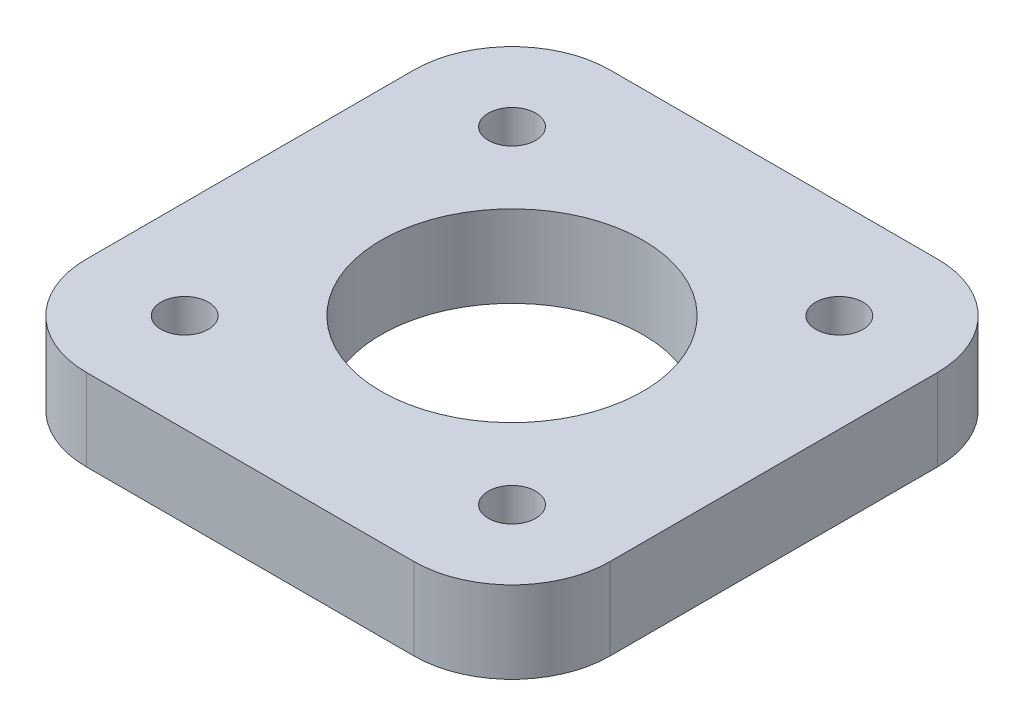
ISO-10303-21;
HEADER;
FILE_DESCRIPTION(('STEP AP214'),'2;1');
FILE_NAME('part.step','',(''),(''),'','','');
FILE_SCHEMA(('AUTOMOTIVE_DESIGN { 1 0 10303 214 1 1 1 1 }'));
ENDSEC;
DATA;
#1=APPLICATION_CONTEXT('core data for automotive mechanical design processes');
#2=APPLICATION_PROTOCOL_DEFINITION('international standard','automotive_design',2000,#1);
#3=PRODUCT_CONTEXT('',#1,'mechanical');
#4=PRODUCT('Part','Part','',(#3));
#5=PRODUCT_RELATED_PRODUCT_CATEGORY('part','',(#4));
#6=PRODUCT_DEFINITION_FORMATION('','',#4);
#7=PRODUCT_DEFINITION_CONTEXT('part definition',#1,'design');
#8=PRODUCT_DEFINITION('design','',#6,#7);
#9=PRODUCT_DEFINITION_SHAPE('','',#8);
#10=(LENGTH_UNIT() NAMED_UNIT(*) SI_UNIT(.MILLI.,.METRE.));
#11=(NAMED_UNIT(*) PLANE_ANGLE_UNIT() SI_UNIT($,.RADIAN.));
#12=(NAMED_UNIT(*) SI_UNIT($,.STERADIAN.) SOLID_ANGLE_UNIT());
#13=UNCERTAINTY_MEASURE_WITH_UNIT(LENGTH_MEASURE(1.E-05),#10,'distance_accuracy_value','');
#14=(GEOMETRIC_REPRESENTATION_CONTEXT(3) GLOBAL_UNCERTAINTY_ASSIGNED_CONTEXT((#13)) GLOBAL_UNIT_ASSIGNED_CONTEXT((#10,
#11,#12)) REPRESENTATION_CONTEXT('',''));
#15=CARTESIAN_POINT('',(0.,0.,0.));
#16=DIRECTION('',(0.,0.,1.));
#17=DIRECTION('',(1.,0.,0.));
#18=AXIS2_PLACEMENT_3D('',#15,#16,#17);
#19=CARTESIAN_POINT('',(-10.,-5.,10.));
#20=DIRECTION('',(0.,1.,0.));
#21=DIRECTION('',(0.,0.,1.));
#22=AXIS2_PLACEMENT_3D('',#19,#20,#21);
#23=CYLINDRICAL_SURFACE('',#22,6.);
#24=CARTESIAN_POINT('',(-10.,0.,10.));
#25=DIRECTION('',(0.,1.,0.));
#26=DIRECTION('',(0.,0.,1.));
#27=AXIS2_PLACEMENT_3D('',#24,#25,#26);
#28=CIRCLE('',#27,6.);
#29=CARTESIAN_POINT('',(-16.,0.,9.99999999999996));
#30=VERTEX_POINT('',#29);
#31=CARTESIAN_POINT('',(-9.99999999999996,0.,16.));
#32=VERTEX_POINT('',#31);
#33=EDGE_CURVE('E133',#30,#32,#28,.T.);
#34=ORIENTED_EDGE('',*,*,#33,.F.);
#35=DIRECTION('',(0.,1.,0.));
#36=VECTOR('',#35,1.);
#37=CARTESIAN_POINT('',(-16.,-5.,9.99999999999996));
#38=LINE('',#37,#36);
#39=CARTESIAN_POINT('',(-16.,-5.,9.99999999999996));
#40=VERTEX_POINT('',#39);
#41=EDGE_CURVE('E11',#40,#30,#38,.T.);
#42=ORIENTED_EDGE('',*,*,#41,.F.);
#43=CARTESIAN_POINT('',(-10.,-5.,10.));
#44=DIRECTION('',(0.,1.,0.));
#45=DIRECTION('',(0.,0.,1.));
#46=AXIS2_PLACEMENT_3D('',#43,#44,#45);
#47=CIRCLE('',#46,6.);
#48=CARTESIAN_POINT('',(-9.99999999999996,-5.,16.));
#49=VERTEX_POINT('',#48);
#50=EDGE_CURVE('E154',#40,#49,#47,.T.);
#51=ORIENTED_EDGE('',*,*,#50,.T.);
#52=DIRECTION('',(0.,1.,0.));
#53=VECTOR('',#52,1.);
#54=CARTESIAN_POINT('',(-9.99999999999996,-5.,16.));
#55=LINE('',#54,#53);
#56=EDGE_CURVE('E39',#49,#32,#55,.T.);
#57=ORIENTED_EDGE('',*,*,#56,.T.);
#58=EDGE_LOOP('',(#34,#42,#51,#57));
#59=FACE_BOUND('',#58,.T.);
#60=ADVANCED_FACE('F36',(#59),#23,.T.);
#61=CARTESIAN_POINT('',(-16.,-5.,-9.99999999999996));
#62=DIRECTION('',(-1.,0.,0.));
#63=DIRECTION('',(0.,0.,1.));
#64=AXIS2_PLACEMENT_3D('',#61,#62,#63);
#65=PLANE('',#64);
#66=DIRECTION('',(0.,0.,1.));
#67=VECTOR('',#66,1.);
#68=CARTESIAN_POINT('',(-16.,0.,-9.99999999999996));
#69=LINE('',#68,#67);
#70=CARTESIAN_POINT('',(-16.,0.,-9.99999999999996));
#71=VERTEX_POINT('',#70);
#72=EDGE_CURVE('E152',#71,#30,#69,.T.);
#73=ORIENTED_EDGE('',*,*,#72,.F.);
#74=DIRECTION('',(0.,1.,0.));
#75=VECTOR('',#74,1.);
#76=CARTESIAN_POINT('',(-16.,-5.,-9.99999999999996));
#77=LINE('',#76,#75);
#78=CARTESIAN_POINT('',(-16.,-5.,-9.99999999999996));
#79=VERTEX_POINT('',#78);
#80=EDGE_CURVE('E45',#79,#71,#77,.T.);
#81=ORIENTED_EDGE('',*,*,#80,.F.);
#82=DIRECTION('',(0.,0.,1.));
#83=VECTOR('',#82,1.);
#84=CARTESIAN_POINT('',(-16.,-5.,-9.99999999999996));
#85=LINE('',#84,#83);
#86=EDGE_CURVE('E123',#79,#40,#85,.T.);
#87=ORIENTED_EDGE('',*,*,#86,.T.);
#88=ORIENTED_EDGE('',*,*,#41,.T.);
#89=EDGE_LOOP('',(#73,#81,#87,#88));
#90=FACE_BOUND('',#89,.T.);
#91=ADVANCED_FACE('F166',(#90),#65,.T.);
#92=CARTESIAN_POINT('',(-10.,-5.,-10.));
#93=DIRECTION('',(0.,1.,0.));
#94=DIRECTION('',(0.,0.,1.));
#95=AXIS2_PLACEMENT_3D('',#92,#93,#94);
#96=CYLINDRICAL_SURFACE('',#95,6.);
#97=CARTESIAN_POINT('',(-10.,0.,-10.));
#98=DIRECTION('',(0.,1.,0.));
#99=DIRECTION('',(0.,0.,1.));
#100=AXIS2_PLACEMENT_3D('',#97,#98,#99);
#101=CIRCLE('',#100,6.);
#102=CARTESIAN_POINT('',(-9.99999999999996,0.,-16.));
#103=VERTEX_POINT('',#102);
#104=EDGE_CURVE('E110',#103,#71,#101,.T.);
#105=ORIENTED_EDGE('',*,*,#104,.F.);
#106=DIRECTION('',(0.,1.,0.));
#107=VECTOR('',#106,1.);
#108=CARTESIAN_POINT('',(-9.99999999999996,-5.,-16.));
#109=LINE('',#108,#107);
#110=CARTESIAN_POINT('',(-9.99999999999996,-5.,-16.));
#111=VERTEX_POINT('',#110);
#112=EDGE_CURVE('E105',#111,#103,#109,.T.);
#113=ORIENTED_EDGE('',*,*,#112,.F.);
#114=CARTESIAN_POINT('',(-10.,-5.,-10.));
#115=DIRECTION('',(0.,1.,0.));
#116=DIRECTION('',(0.,0.,1.));
#117=AXIS2_PLACEMENT_3D('',#114,#115,#116);
#118=CIRCLE('',#117,6.);
#119=EDGE_CURVE('E108',#111,#79,#118,.T.);
#120=ORIENTED_EDGE('',*,*,#119,.T.);
#121=ORIENTED_EDGE('',*,*,#80,.T.);
#122=EDGE_LOOP('',(#105,#113,#120,#121));
#123=FACE_BOUND('',#122,.T.);
#124=ADVANCED_FACE('F107',(#123),#96,.T.);
#125=CARTESIAN_POINT('',(-9.99999999999996,-5.,-16.));
#126=DIRECTION('',(0.,0.,-1.));
#127=DIRECTION('',(-1.,0.,0.));
#128=AXIS2_PLACEMENT_3D('',#125,#126,#127);
#129=PLANE('',#128);
#130=DIRECTION('',(-1.,0.,0.));
#131=VECTOR('',#130,1.);
#132=CARTESIAN_POINT('',(-9.99999999999996,0.,-16.));
#133=LINE('',#132,#131);
#134=CARTESIAN_POINT('',(9.99999999999996,0.,-16.));
#135=VERTEX_POINT('',#134);
#136=EDGE_CURVE('E149',#135,#103,#133,.T.);
#137=ORIENTED_EDGE('',*,*,#136,.F.);
#138=DIRECTION('',(0.,1.,0.));
#139=VECTOR('',#138,1.);
#140=CARTESIAN_POINT('',(9.99999999999996,-5.,-16.));
#141=LINE('',#140,#139);
#142=CARTESIAN_POINT('',(9.99999999999996,-5.,-16.));
#143=VERTEX_POINT('',#142);
#144=EDGE_CURVE('E115',#143,#135,#141,.T.);
#145=ORIENTED_EDGE('',*,*,#144,.F.);
#146=DIRECTION('',(-1.,0.,0.));
#147=VECTOR('',#146,1.);
#148=CARTESIAN_POINT('',(-9.99999999999996,-5.,-16.));
#149=LINE('',#148,#147);
#150=EDGE_CURVE('E121',#143,#111,#149,.T.);
#151=ORIENTED_EDGE('',*,*,#150,.T.);
#152=ORIENTED_EDGE('',*,*,#112,.T.);
#153=EDGE_LOOP('',(#137,#145,#151,#152));
#154=FACE_BOUND('',#153,.T.);
#155=ADVANCED_FACE('F125',(#154),#129,.T.);
#156=CARTESIAN_POINT('',(10.,-5.,-10.));
#157=DIRECTION('',(0.,1.,0.));
#158=DIRECTION('',(0.,0.,1.));
#159=AXIS2_PLACEMENT_3D('',#156,#157,#158);
#160=CYLINDRICAL_SURFACE('',#159,6.);
#161=CARTESIAN_POINT('',(10.,0.,-10.));
#162=DIRECTION('',(0.,1.,0.));
#163=DIRECTION('',(0.,0.,-1.));
#164=AXIS2_PLACEMENT_3D('',#161,#162,#163);
#165=CIRCLE('',#164,6.);
#166=CARTESIAN_POINT('',(16.,0.,-9.99999999999996));
#167=VERTEX_POINT('',#166);
#168=EDGE_CURVE('E146',#167,#135,#165,.T.);
#169=ORIENTED_EDGE('',*,*,#168,.F.);
#170=DIRECTION('',(0.,1.,0.));
#171=VECTOR('',#170,1.);
#172=CARTESIAN_POINT('',(16.,-5.,-9.99999999999996));
#173=LINE('',#172,#171);
#174=CARTESIAN_POINT('',(16.,-5.,-9.99999999999996));
#175=VERTEX_POINT('',#174);
#176=EDGE_CURVE('E158',#175,#167,#173,.T.);
#177=ORIENTED_EDGE('',*,*,#176,.F.);
#178=CARTESIAN_POINT('',(10.,-5.,-10.));
#179=DIRECTION('',(0.,1.,0.));
#180=DIRECTION('',(0.,0.,-1.));
#181=AXIS2_PLACEMENT_3D('',#178,#179,#180);
#182=CIRCLE('',#181,6.);
#183=EDGE_CURVE('E126',#175,#143,#182,.T.);
#184=ORIENTED_EDGE('',*,*,#183,.T.);
#185=ORIENTED_EDGE('',*,*,#144,.T.);
#186=EDGE_LOOP('',(#169,#177,#184,#185));
#187=FACE_BOUND('',#186,.T.);
#188=ADVANCED_FACE('F179',(#187),#160,.T.);
#189=CARTESIAN_POINT('',(16.,-5.,-9.99999999999996));
#190=DIRECTION('',(1.,0.,0.));
#191=DIRECTION('',(0.,0.,-1.));
#192=AXIS2_PLACEMENT_3D('',#189,#190,#191);
#193=PLANE('',#192);
#194=DIRECTION('',(0.,0.,-1.));
#195=VECTOR('',#194,1.);
#196=CARTESIAN_POINT('',(16.,0.,-9.99999999999996));
#197=LINE('',#196,#195);
#198=CARTESIAN_POINT('',(16.,0.,9.99999999999996));
#199=VERTEX_POINT('',#198);
#200=EDGE_CURVE('E143',#199,#167,#197,.T.);
#201=ORIENTED_EDGE('',*,*,#200,.F.);
#202=DIRECTION('',(0.,1.,0.));
#203=VECTOR('',#202,1.);
#204=CARTESIAN_POINT('',(16.,-5.,9.99999999999996));
#205=LINE('',#204,#203);
#206=CARTESIAN_POINT('',(16.,-5.,9.99999999999996));
#207=VERTEX_POINT('',#206);
#208=EDGE_CURVE('E160',#207,#199,#205,.T.);
#209=ORIENTED_EDGE('',*,*,#208,.F.);
#210=DIRECTION('',(0.,0.,-1.));
#211=VECTOR('',#210,1.);
#212=CARTESIAN_POINT('',(16.,-5.,-9.99999999999996));
#213=LINE('',#212,#211);
#214=EDGE_CURVE('E128',#207,#175,#213,.T.);
#215=ORIENTED_EDGE('',*,*,#214,.T.);
#216=ORIENTED_EDGE('',*,*,#176,.T.);
#217=EDGE_LOOP('',(#201,#209,#215,#216));
#218=FACE_BOUND('',#217,.T.);
#219=ADVANCED_FACE('F182',(#218),#193,.T.);
#220=CARTESIAN_POINT('',(10.,-5.,10.));
#221=DIRECTION('',(0.,1.,0.));
#222=DIRECTION('',(0.,0.,1.));
#223=AXIS2_PLACEMENT_3D('',#220,#221,#222);
#224=CYLINDRICAL_SURFACE('',#223,6.);
#225=CARTESIAN_POINT('',(10.,0.,10.));
#226=DIRECTION('',(0.,1.,0.));
#227=DIRECTION('',(0.,0.,1.));
#228=AXIS2_PLACEMENT_3D('',#225,#226,#227);
#229=CIRCLE('',#228,6.);
#230=CARTESIAN_POINT('',(9.99999999999996,0.,16.));
#231=VERTEX_POINT('',#230);
#232=EDGE_CURVE('E140',#231,#199,#229,.T.);
#233=ORIENTED_EDGE('',*,*,#232,.F.);
#234=DIRECTION('',(0.,1.,0.));
#235=VECTOR('',#234,1.);
#236=CARTESIAN_POINT('',(9.99999999999996,-5.,16.));
#237=LINE('',#236,#235);
#238=CARTESIAN_POINT('',(9.99999999999996,-5.,16.));
#239=VERTEX_POINT('',#238);
#240=EDGE_CURVE('E161',#239,#231,#237,.T.);
#241=ORIENTED_EDGE('',*,*,#240,.F.);
#242=CARTESIAN_POINT('',(10.,-5.,10.));
#243=DIRECTION('',(0.,1.,0.));
#244=DIRECTION('',(0.,0.,1.));
#245=AXIS2_PLACEMENT_3D('',#242,#243,#244);
#246=CIRCLE('',#245,6.);
#247=EDGE_CURVE('E258',#239,#207,#246,.T.);
#248=ORIENTED_EDGE('',*,*,#247,.T.);
#249=ORIENTED_EDGE('',*,*,#208,.T.);
#250=EDGE_LOOP('',(#233,#241,#248,#249));
#251=FACE_BOUND('',#250,.T.);
#252=ADVANCED_FACE('F186',(#251),#224,.T.);
#253=CARTESIAN_POINT('',(-9.99999999999996,-5.,16.));
#254=DIRECTION('',(0.,0.,1.));
#255=DIRECTION('',(1.,0.,0.));
#256=AXIS2_PLACEMENT_3D('',#253,#254,#255);
#257=PLANE('',#256);
#258=DIRECTION('',(1.,0.,0.));
#259=VECTOR('',#258,1.);
#260=CARTESIAN_POINT('',(-9.99999999999996,0.,16.));
#261=LINE('',#260,#259);
#262=EDGE_CURVE('E136',#32,#231,#261,.T.);
#263=ORIENTED_EDGE('',*,*,#262,.F.);
#264=ORIENTED_EDGE('',*,*,#56,.F.);
#265=DIRECTION('',(1.,0.,0.));
#266=VECTOR('',#265,1.);
#267=CARTESIAN_POINT('',(-9.99999999999996,-5.,16.));
#268=LINE('',#267,#266);
#269=EDGE_CURVE('E256',#49,#239,#268,.T.);
#270=ORIENTED_EDGE('',*,*,#269,.T.);
#271=ORIENTED_EDGE('',*,*,#240,.T.);
#272=EDGE_LOOP('',(#263,#264,#270,#271));
#273=FACE_BOUND('',#272,.T.);
#274=ADVANCED_FACE('F163',(#273),#257,.T.);
#275=CARTESIAN_POINT('',(-10.,-5.,10.));
#276=DIRECTION('',(0.,1.,0.));
#277=DIRECTION('',(0.,0.,1.));
#278=AXIS2_PLACEMENT_3D('',#275,#276,#277);
#279=PLANE('',#278);
#280=CARTESIAN_POINT('',(-9.99999999999979,-5.,10.));
#281=DIRECTION('',(0.,1.,0.));
#282=DIRECTION('',(0.,0.,1.));
#283=AXIS2_PLACEMENT_3D('',#280,#281,#282);
#284=CIRCLE('',#283,1.44571185103988);
#285=CARTESIAN_POINT('',(-9.99999999999979,-5.,11.4457118510399));
#286=VERTEX_POINT('',#285);
#287=EDGE_CURVE('E225',#286,#286,#284,.T.);
#288=ORIENTED_EDGE('',*,*,#287,.T.);
#289=EDGE_LOOP('',(#288));
#290=FACE_BOUND('',#289,.T.);
#291=CARTESIAN_POINT('',(10.0000000000002,-5.,10.));
#292=DIRECTION('',(0.,1.,0.));
#293=DIRECTION('',(0.,0.,1.));
#294=AXIS2_PLACEMENT_3D('',#291,#292,#293);
#295=CIRCLE('',#294,1.44571185103988);
#296=CARTESIAN_POINT('',(10.0000000000002,-5.,11.4457118510399));
#297=VERTEX_POINT('',#296);
#298=EDGE_CURVE('E233',#297,#297,#295,.T.);
#299=ORIENTED_EDGE('',*,*,#298,.T.);
#300=EDGE_LOOP('',(#299));
#301=FACE_BOUND('',#300,.T.);
#302=CARTESIAN_POINT('',(10.,-5.,-10.));
#303=DIRECTION('',(0.,1.,0.));
#304=DIRECTION('',(0.,0.,1.));
#305=AXIS2_PLACEMENT_3D('',#302,#303,#304);
#306=CIRCLE('',#305,1.44571185103988);
#307=CARTESIAN_POINT('',(10.,-5.,-8.55428814896012));
#308=VERTEX_POINT('',#307);
#309=EDGE_CURVE('E239',#308,#308,#306,.T.);
#310=ORIENTED_EDGE('',*,*,#309,.T.);
#311=EDGE_LOOP('',(#310));
#312=FACE_BOUND('',#311,.T.);
#313=CARTESIAN_POINT('',(-10.,-5.,-10.));
#314=DIRECTION('',(0.,1.,0.));
#315=DIRECTION('',(0.,0.,1.));
#316=AXIS2_PLACEMENT_3D('',#313,#314,#315);
#317=CIRCLE('',#316,1.44571185103988);
#318=CARTESIAN_POINT('',(-10.,-5.,-8.55428814896012));
#319=VERTEX_POINT('',#318);
#320=EDGE_CURVE('E245',#319,#319,#317,.T.);
#321=ORIENTED_EDGE('',*,*,#320,.T.);
#322=EDGE_LOOP('',(#321));
#323=FACE_BOUND('',#322,.T.);
#324=CARTESIAN_POINT('',(0.,-5.,0.));
#325=DIRECTION('',(0.,1.,0.));
#326=DIRECTION('',(0.,0.,1.));
#327=AXIS2_PLACEMENT_3D('',#324,#325,#326);
#328=CIRCLE('',#327,8.);
#329=CARTESIAN_POINT('',(0.,-5.,8.));
#330=VERTEX_POINT('',#329);
#331=EDGE_CURVE('E137',#330,#330,#328,.T.);
#332=ORIENTED_EDGE('',*,*,#331,.T.);
#333=EDGE_LOOP('',(#332));
#334=FACE_BOUND('',#333,.T.);
#335=ORIENTED_EDGE('',*,*,#50,.F.);
#336=ORIENTED_EDGE('',*,*,#86,.F.);
#337=ORIENTED_EDGE('',*,*,#119,.F.);
#338=ORIENTED_EDGE('',*,*,#150,.F.);
#339=ORIENTED_EDGE('',*,*,#183,.F.);
#340=ORIENTED_EDGE('',*,*,#214,.F.);
#341=ORIENTED_EDGE('',*,*,#247,.F.);
#342=ORIENTED_EDGE('',*,*,#269,.F.);
#343=EDGE_LOOP('',(#335,#336,#337,#338,#339,#340,#341,#342));
#344=FACE_BOUND('',#343,.T.);
#345=ADVANCED_FACE('F119',(#290,#301,#312,#323,#334,#344),#279,.F.);
#346=CARTESIAN_POINT('',(-10.,0.,10.));
#347=DIRECTION('',(0.,1.,0.));
#348=DIRECTION('',(0.,0.,1.));
#349=AXIS2_PLACEMENT_3D('',#346,#347,#348);
#350=PLANE('',#349);
#351=CARTESIAN_POINT('',(-9.99999999999979,0.,10.));
#352=DIRECTION('',(0.,1.,0.));
#353=DIRECTION('',(0.,0.,1.));
#354=AXIS2_PLACEMENT_3D('',#351,#352,#353);
#355=CIRCLE('',#354,1.44571185103988);
#356=CARTESIAN_POINT('',(-9.99999999999979,0.,11.4457118510399));
#357=VERTEX_POINT('',#356);
#358=EDGE_CURVE('E228',#357,#357,#355,.T.);
#359=ORIENTED_EDGE('',*,*,#358,.F.);
#360=EDGE_LOOP('',(#359));
#361=FACE_BOUND('',#360,.T.);
#362=CARTESIAN_POINT('',(10.0000000000002,0.,10.));
#363=DIRECTION('',(0.,1.,0.));
#364=DIRECTION('',(0.,0.,1.));
#365=AXIS2_PLACEMENT_3D('',#362,#363,#364);
#366=CIRCLE('',#365,1.44571185103988);
#367=CARTESIAN_POINT('',(10.0000000000002,0.,11.4457118510399));
#368=VERTEX_POINT('',#367);
#369=EDGE_CURVE('E230',#368,#368,#366,.T.);
#370=ORIENTED_EDGE('',*,*,#369,.F.);
#371=EDGE_LOOP('',(#370));
#372=FACE_BOUND('',#371,.T.);
#373=CARTESIAN_POINT('',(10.,0.,-10.));
#374=DIRECTION('',(0.,1.,0.));
#375=DIRECTION('',(0.,0.,1.));
#376=AXIS2_PLACEMENT_3D('',#373,#374,#375);
#377=CIRCLE('',#376,1.44571185103988);
#378=CARTESIAN_POINT('',(10.,0.,-8.55428814896012));
#379=VERTEX_POINT('',#378);
#380=EDGE_CURVE('E236',#379,#379,#377,.T.);
#381=ORIENTED_EDGE('',*,*,#380,.F.);
#382=EDGE_LOOP('',(#381));
#383=FACE_BOUND('',#382,.T.);
#384=CARTESIAN_POINT('',(-10.,0.,-10.));
#385=DIRECTION('',(0.,1.,0.));
#386=DIRECTION('',(0.,0.,1.));
#387=AXIS2_PLACEMENT_3D('',#384,#385,#386);
#388=CIRCLE('',#387,1.44571185103988);
#389=CARTESIAN_POINT('',(-10.,0.,-8.55428814896012));
#390=VERTEX_POINT('',#389);
#391=EDGE_CURVE('E242',#390,#390,#388,.T.);
#392=ORIENTED_EDGE('',*,*,#391,.F.);
#393=EDGE_LOOP('',(#392));
#394=FACE_BOUND('',#393,.T.);
#395=CARTESIAN_POINT('',(0.,0.,0.));
#396=DIRECTION('',(0.,1.,0.));
#397=DIRECTION('',(0.,0.,1.));
#398=AXIS2_PLACEMENT_3D('',#395,#396,#397);
#399=CIRCLE('',#398,8.);
#400=CARTESIAN_POINT('',(0.,0.,8.));
#401=VERTEX_POINT('',#400);
#402=EDGE_CURVE('E248',#401,#401,#399,.T.);
#403=ORIENTED_EDGE('',*,*,#402,.F.);
#404=EDGE_LOOP('',(#403));
#405=FACE_BOUND('',#404,.T.);
#406=ORIENTED_EDGE('',*,*,#33,.T.);
#407=ORIENTED_EDGE('',*,*,#262,.T.);
#408=ORIENTED_EDGE('',*,*,#232,.T.);
#409=ORIENTED_EDGE('',*,*,#200,.T.);
#410=ORIENTED_EDGE('',*,*,#168,.T.);
#411=ORIENTED_EDGE('',*,*,#136,.T.);
#412=ORIENTED_EDGE('',*,*,#104,.T.);
#413=ORIENTED_EDGE('',*,*,#72,.T.);
#414=EDGE_LOOP('',(#406,#407,#408,#409,#410,#411,#412,#413));
#415=FACE_BOUND('',#414,.T.);
#416=ADVANCED_FACE('F165',(#361,#372,#383,#394,#405,#415),#350,.T.);
#417=CARTESIAN_POINT('',(0.,-5.,0.));
#418=DIRECTION('',(0.,1.,0.));
#419=DIRECTION('',(0.,0.,1.));
#420=AXIS2_PLACEMENT_3D('',#417,#418,#419);
#421=CYLINDRICAL_SURFACE('',#420,8.);
#422=ORIENTED_EDGE('',*,*,#331,.F.);
#423=EDGE_LOOP('',(#422));
#424=FACE_BOUND('',#423,.T.);
#425=ORIENTED_EDGE('',*,*,#402,.T.);
#426=EDGE_LOOP('',(#425));
#427=FACE_BOUND('',#426,.T.);
#428=ADVANCED_FACE('F198',(#424,#427),#421,.F.);
#429=CARTESIAN_POINT('',(-10.,-5.,-10.));
#430=DIRECTION('',(0.,1.,0.));
#431=DIRECTION('',(0.,0.,1.));
#432=AXIS2_PLACEMENT_3D('',#429,#430,#431);
#433=CYLINDRICAL_SURFACE('',#432,1.44571185103988);
#434=ORIENTED_EDGE('',*,*,#320,.F.);
#435=EDGE_LOOP('',(#434));
#436=FACE_BOUND('',#435,.T.);
#437=ORIENTED_EDGE('',*,*,#391,.T.);
#438=EDGE_LOOP('',(#437));
#439=FACE_BOUND('',#438,.T.);
#440=ADVANCED_FACE('F205',(#436,#439),#433,.F.);
#441=CARTESIAN_POINT('',(10.,-5.,-10.));
#442=DIRECTION('',(0.,1.,0.));
#443=DIRECTION('',(0.,0.,1.));
#444=AXIS2_PLACEMENT_3D('',#441,#442,#443);
#445=CYLINDRICAL_SURFACE('',#444,1.44571185103988);
#446=ORIENTED_EDGE('',*,*,#309,.F.);
#447=EDGE_LOOP('',(#446));
#448=FACE_BOUND('',#447,.T.);
#449=ORIENTED_EDGE('',*,*,#380,.T.);
#450=EDGE_LOOP('',(#449));
#451=FACE_BOUND('',#450,.T.);
#452=ADVANCED_FACE('F209',(#448,#451),#445,.F.);
#453=CARTESIAN_POINT('',(10.0000000000002,-5.,10.));
#454=DIRECTION('',(0.,1.,0.));
#455=DIRECTION('',(0.,0.,1.));
#456=AXIS2_PLACEMENT_3D('',#453,#454,#455);
#457=CYLINDRICAL_SURFACE('',#456,1.44571185103988);
#458=ORIENTED_EDGE('',*,*,#298,.F.);
#459=EDGE_LOOP('',(#458));
#460=FACE_BOUND('',#459,.T.);
#461=ORIENTED_EDGE('',*,*,#369,.T.);
#462=EDGE_LOOP('',(#461));
#463=FACE_BOUND('',#462,.T.);
#464=ADVANCED_FACE('F213',(#460,#463),#457,.F.);
#465=CARTESIAN_POINT('',(-9.99999999999979,-5.,10.));
#466=DIRECTION('',(0.,1.,0.));
#467=DIRECTION('',(0.,0.,1.));
#468=AXIS2_PLACEMENT_3D('',#465,#466,#467);
#469=CYLINDRICAL_SURFACE('',#468,1.44571185103988);
#470=ORIENTED_EDGE('',*,*,#287,.F.);
#471=EDGE_LOOP('',(#470));
#472=FACE_BOUND('',#471,.T.);
#473=ORIENTED_EDGE('',*,*,#358,.T.);
#474=EDGE_LOOP('',(#473));
#475=FACE_BOUND('',#474,.T.);
#476=ADVANCED_FACE('F217',(#472,#475),#469,.F.);
#477=CLOSED_SHELL('',(#60,#91,#124,#155,#188,#219,#252,#274,#345,#416,#428,#440,#452,#464,#476));
#478=MANIFOLD_SOLID_BREP('B2',#477);
#479=ADVANCED_BREP_SHAPE_REPRESENTATION('',(#18,#478),#14);
#480=SHAPE_DEFINITION_REPRESENTATION(#9,#479);
ENDSEC;
END-ISO-10303-21;
